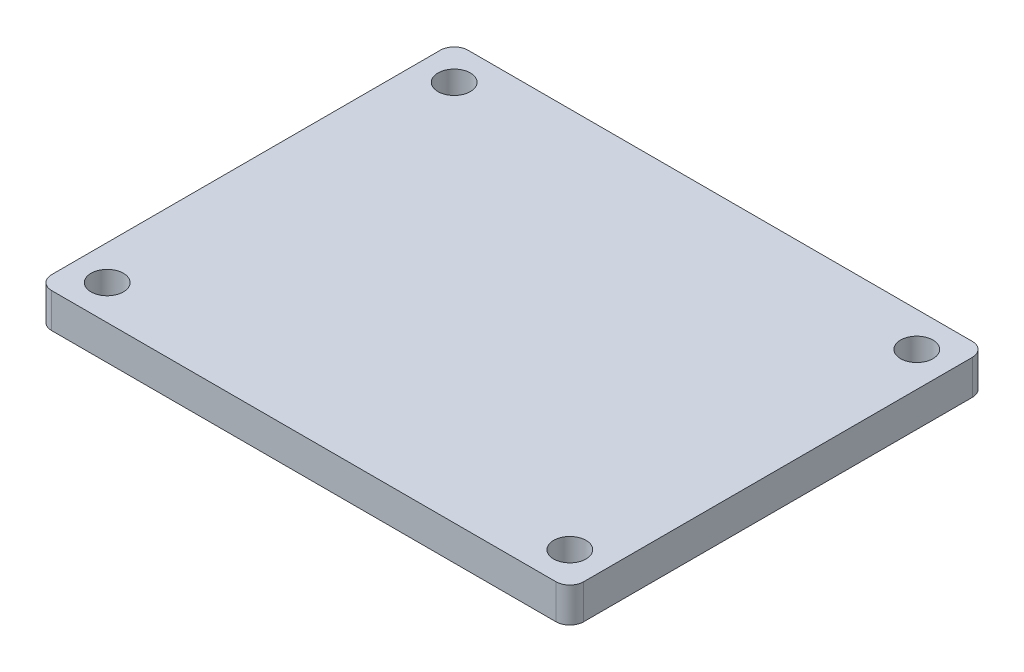
ISO-10303-21;
HEADER;
FILE_DESCRIPTION(('STEP AP214'),'2;1');
FILE_NAME('part.step','',(''),(''),'','','');
FILE_SCHEMA(('AUTOMOTIVE_DESIGN { 1 0 10303 214 1 1 1 1 }'));
ENDSEC;
DATA;
#1=APPLICATION_CONTEXT('core data for automotive mechanical design processes');
#2=APPLICATION_PROTOCOL_DEFINITION('international standard','automotive_design',2000,#1);
#3=PRODUCT_CONTEXT('',#1,'mechanical');
#4=PRODUCT('Part','Part','',(#3));
#5=PRODUCT_RELATED_PRODUCT_CATEGORY('part','',(#4));
#6=PRODUCT_DEFINITION_FORMATION('','',#4);
#7=PRODUCT_DEFINITION_CONTEXT('part definition',#1,'design');
#8=PRODUCT_DEFINITION('design','',#6,#7);
#9=PRODUCT_DEFINITION_SHAPE('','',#8);
#10=(LENGTH_UNIT() NAMED_UNIT(*) SI_UNIT(.MILLI.,.METRE.));
#11=(NAMED_UNIT(*) PLANE_ANGLE_UNIT() SI_UNIT($,.RADIAN.));
#12=(NAMED_UNIT(*) SI_UNIT($,.STERADIAN.) SOLID_ANGLE_UNIT());
#13=UNCERTAINTY_MEASURE_WITH_UNIT(LENGTH_MEASURE(1.E-05),#10,'distance_accuracy_value','');
#14=(GEOMETRIC_REPRESENTATION_CONTEXT(3) GLOBAL_UNCERTAINTY_ASSIGNED_CONTEXT((#13)) GLOBAL_UNIT_ASSIGNED_CONTEXT((#10,
#11,#12)) REPRESENTATION_CONTEXT('',''));
#15=CARTESIAN_POINT('',(0.,0.,0.));
#16=DIRECTION('',(0.,0.,1.));
#17=DIRECTION('',(1.,0.,0.));
#18=AXIS2_PLACEMENT_3D('',#15,#16,#17);
#19=CARTESIAN_POINT('',(54.5,7.5,-42.));
#20=DIRECTION('',(0.,-1.,0.));
#21=DIRECTION('',(0.,0.,-1.));
#22=AXIS2_PLACEMENT_3D('',#19,#20,#21);
#23=CYLINDRICAL_SURFACE('',#22,3.);
#24=CARTESIAN_POINT('',(54.5,0.,-42.));
#25=DIRECTION('',(0.,1.,0.));
#26=DIRECTION('',(0.,0.,1.));
#27=AXIS2_PLACEMENT_3D('',#24,#25,#26);
#28=CIRCLE('',#27,3.);
#29=CARTESIAN_POINT('',(57.5,0.,-42.));
#30=VERTEX_POINT('',#29);
#31=CARTESIAN_POINT('',(54.5,0.,-45.));
#32=VERTEX_POINT('',#31);
#33=EDGE_CURVE('E135',#30,#32,#28,.T.);
#34=ORIENTED_EDGE('',*,*,#33,.T.);
#35=DIRECTION('',(0.,-1.,0.));
#36=VECTOR('',#35,1.);
#37=CARTESIAN_POINT('',(54.5,7.5,-45.));
#38=LINE('',#37,#36);
#39=CARTESIAN_POINT('',(54.5,7.5,-45.));
#40=VERTEX_POINT('',#39);
#41=EDGE_CURVE('E11',#40,#32,#38,.T.);
#42=ORIENTED_EDGE('',*,*,#41,.F.);
#43=CARTESIAN_POINT('',(54.5,7.5,-42.));
#44=DIRECTION('',(0.,1.,0.));
#45=DIRECTION('',(0.,0.,1.));
#46=AXIS2_PLACEMENT_3D('',#43,#44,#45);
#47=CIRCLE('',#46,3.);
#48=CARTESIAN_POINT('',(57.5,7.5,-42.));
#49=VERTEX_POINT('',#48);
#50=EDGE_CURVE('E150',#49,#40,#47,.T.);
#51=ORIENTED_EDGE('',*,*,#50,.F.);
#52=DIRECTION('',(0.,-1.,0.));
#53=VECTOR('',#52,1.);
#54=CARTESIAN_POINT('',(57.5,7.5,-42.));
#55=LINE('',#54,#53);
#56=EDGE_CURVE('E131',#49,#30,#55,.T.);
#57=ORIENTED_EDGE('',*,*,#56,.T.);
#58=EDGE_LOOP('',(#34,#42,#51,#57));
#59=FACE_BOUND('',#58,.T.);
#60=ADVANCED_FACE('F39',(#59),#23,.T.);
#61=CARTESIAN_POINT('',(54.5,7.5,-45.));
#62=DIRECTION('',(0.,0.,1.));
#63=DIRECTION('',(1.,0.,0.));
#64=AXIS2_PLACEMENT_3D('',#61,#62,#63);
#65=PLANE('',#64);
#66=DIRECTION('',(-1.,0.,0.));
#67=VECTOR('',#66,1.);
#68=CARTESIAN_POINT('',(54.5,0.,-45.));
#69=LINE('',#68,#67);
#70=CARTESIAN_POINT('',(-54.5,0.,-45.));
#71=VERTEX_POINT('',#70);
#72=EDGE_CURVE('E138',#32,#71,#69,.T.);
#73=ORIENTED_EDGE('',*,*,#72,.T.);
#74=DIRECTION('',(0.,-1.,0.));
#75=VECTOR('',#74,1.);
#76=CARTESIAN_POINT('',(-54.5,7.5,-45.));
#77=LINE('',#76,#75);
#78=CARTESIAN_POINT('',(-54.5,7.5,-45.));
#79=VERTEX_POINT('',#78);
#80=EDGE_CURVE('E47',#79,#71,#77,.T.);
#81=ORIENTED_EDGE('',*,*,#80,.F.);
#82=DIRECTION('',(-1.,0.,0.));
#83=VECTOR('',#82,1.);
#84=CARTESIAN_POINT('',(54.5,7.5,-45.));
#85=LINE('',#84,#83);
#86=EDGE_CURVE('E98',#40,#79,#85,.T.);
#87=ORIENTED_EDGE('',*,*,#86,.F.);
#88=ORIENTED_EDGE('',*,*,#41,.T.);
#89=EDGE_LOOP('',(#73,#81,#87,#88));
#90=FACE_BOUND('',#89,.T.);
#91=ADVANCED_FACE('F235',(#90),#65,.F.);
#92=CARTESIAN_POINT('',(-54.5,7.5,-42.));
#93=DIRECTION('',(0.,-1.,0.));
#94=DIRECTION('',(0.,0.,-1.));
#95=AXIS2_PLACEMENT_3D('',#92,#93,#94);
#96=CYLINDRICAL_SURFACE('',#95,3.);
#97=CARTESIAN_POINT('',(-54.5,0.,-42.));
#98=DIRECTION('',(0.,1.,0.));
#99=DIRECTION('',(0.,0.,1.));
#100=AXIS2_PLACEMENT_3D('',#97,#98,#99);
#101=CIRCLE('',#100,3.);
#102=CARTESIAN_POINT('',(-57.5,0.,-42.));
#103=VERTEX_POINT('',#102);
#104=EDGE_CURVE('E141',#71,#103,#101,.T.);
#105=ORIENTED_EDGE('',*,*,#104,.T.);
#106=DIRECTION('',(0.,-1.,0.));
#107=VECTOR('',#106,1.);
#108=CARTESIAN_POINT('',(-57.5,7.5,-42.));
#109=LINE('',#108,#107);
#110=CARTESIAN_POINT('',(-57.5,7.5,-42.));
#111=VERTEX_POINT('',#110);
#112=EDGE_CURVE('E157',#111,#103,#109,.T.);
#113=ORIENTED_EDGE('',*,*,#112,.F.);
#114=CARTESIAN_POINT('',(-54.5,7.5,-42.));
#115=DIRECTION('',(0.,1.,0.));
#116=DIRECTION('',(0.,0.,1.));
#117=AXIS2_PLACEMENT_3D('',#114,#115,#116);
#118=CIRCLE('',#117,3.);
#119=EDGE_CURVE('E165',#79,#111,#118,.T.);
#120=ORIENTED_EDGE('',*,*,#119,.F.);
#121=ORIENTED_EDGE('',*,*,#80,.T.);
#122=EDGE_LOOP('',(#105,#113,#120,#121));
#123=FACE_BOUND('',#122,.T.);
#124=ADVANCED_FACE('F163',(#123),#96,.T.);
#125=CARTESIAN_POINT('',(-57.5,7.5,42.));
#126=DIRECTION('',(1.,0.,0.));
#127=DIRECTION('',(0.,0.,-1.));
#128=AXIS2_PLACEMENT_3D('',#125,#126,#127);
#129=PLANE('',#128);
#130=DIRECTION('',(0.,0.,1.));
#131=VECTOR('',#130,1.);
#132=CARTESIAN_POINT('',(-57.5,0.,42.));
#133=LINE('',#132,#131);
#134=CARTESIAN_POINT('',(-57.5,0.,42.));
#135=VERTEX_POINT('',#134);
#136=EDGE_CURVE('E143',#103,#135,#133,.T.);
#137=ORIENTED_EDGE('',*,*,#136,.T.);
#138=DIRECTION('',(0.,-1.,0.));
#139=VECTOR('',#138,1.);
#140=CARTESIAN_POINT('',(-57.5,7.5,42.));
#141=LINE('',#140,#139);
#142=CARTESIAN_POINT('',(-57.5,7.5,42.));
#143=VERTEX_POINT('',#142);
#144=EDGE_CURVE('E154',#143,#135,#141,.T.);
#145=ORIENTED_EDGE('',*,*,#144,.F.);
#146=DIRECTION('',(0.,0.,1.));
#147=VECTOR('',#146,1.);
#148=CARTESIAN_POINT('',(-57.5,7.5,42.));
#149=LINE('',#148,#147);
#150=EDGE_CURVE('E177',#111,#143,#149,.T.);
#151=ORIENTED_EDGE('',*,*,#150,.F.);
#152=ORIENTED_EDGE('',*,*,#112,.T.);
#153=EDGE_LOOP('',(#137,#145,#151,#152));
#154=FACE_BOUND('',#153,.T.);
#155=ADVANCED_FACE('F173',(#154),#129,.F.);
#156=CARTESIAN_POINT('',(-54.5,7.5,42.));
#157=DIRECTION('',(0.,-1.,0.));
#158=DIRECTION('',(0.,0.,-1.));
#159=AXIS2_PLACEMENT_3D('',#156,#157,#158);
#160=CYLINDRICAL_SURFACE('',#159,3.);
#161=CARTESIAN_POINT('',(-54.5,0.,42.));
#162=DIRECTION('',(0.,1.,0.));
#163=DIRECTION('',(0.,0.,-1.));
#164=AXIS2_PLACEMENT_3D('',#161,#162,#163);
#165=CIRCLE('',#164,3.);
#166=CARTESIAN_POINT('',(-54.5,0.,45.));
#167=VERTEX_POINT('',#166);
#168=EDGE_CURVE('E145',#135,#167,#165,.T.);
#169=ORIENTED_EDGE('',*,*,#168,.T.);
#170=DIRECTION('',(0.,-1.,0.));
#171=VECTOR('',#170,1.);
#172=CARTESIAN_POINT('',(-54.5,7.5,45.));
#173=LINE('',#172,#171);
#174=CARTESIAN_POINT('',(-54.5,7.5,45.));
#175=VERTEX_POINT('',#174);
#176=EDGE_CURVE('E126',#175,#167,#173,.T.);
#177=ORIENTED_EDGE('',*,*,#176,.F.);
#178=CARTESIAN_POINT('',(-54.5,7.5,42.));
#179=DIRECTION('',(0.,1.,0.));
#180=DIRECTION('',(0.,0.,-1.));
#181=AXIS2_PLACEMENT_3D('',#178,#179,#180);
#182=CIRCLE('',#181,3.);
#183=EDGE_CURVE('E117',#143,#175,#182,.T.);
#184=ORIENTED_EDGE('',*,*,#183,.F.);
#185=ORIENTED_EDGE('',*,*,#144,.T.);
#186=EDGE_LOOP('',(#169,#177,#184,#185));
#187=FACE_BOUND('',#186,.T.);
#188=ADVANCED_FACE('F176',(#187),#160,.T.);
#189=CARTESIAN_POINT('',(54.5,7.5,45.));
#190=DIRECTION('',(0.,0.,-1.));
#191=DIRECTION('',(-1.,0.,0.));
#192=AXIS2_PLACEMENT_3D('',#189,#190,#191);
#193=PLANE('',#192);
#194=DIRECTION('',(1.,0.,0.));
#195=VECTOR('',#194,1.);
#196=CARTESIAN_POINT('',(54.5,0.,45.));
#197=LINE('',#196,#195);
#198=CARTESIAN_POINT('',(54.5,0.,45.));
#199=VERTEX_POINT('',#198);
#200=EDGE_CURVE('E125',#167,#199,#197,.T.);
#201=ORIENTED_EDGE('',*,*,#200,.T.);
#202=DIRECTION('',(0.,-1.,0.));
#203=VECTOR('',#202,1.);
#204=CARTESIAN_POINT('',(54.5,7.5,45.));
#205=LINE('',#204,#203);
#206=CARTESIAN_POINT('',(54.5,7.5,45.));
#207=VERTEX_POINT('',#206);
#208=EDGE_CURVE('E122',#207,#199,#205,.T.);
#209=ORIENTED_EDGE('',*,*,#208,.F.);
#210=DIRECTION('',(1.,0.,0.));
#211=VECTOR('',#210,1.);
#212=CARTESIAN_POINT('',(54.5,7.5,45.));
#213=LINE('',#212,#211);
#214=EDGE_CURVE('E111',#175,#207,#213,.T.);
#215=ORIENTED_EDGE('',*,*,#214,.F.);
#216=ORIENTED_EDGE('',*,*,#176,.T.);
#217=EDGE_LOOP('',(#201,#209,#215,#216));
#218=FACE_BOUND('',#217,.T.);
#219=ADVANCED_FACE('F123',(#218),#193,.F.);
#220=CARTESIAN_POINT('',(54.5,7.5,42.));
#221=DIRECTION('',(0.,-1.,0.));
#222=DIRECTION('',(0.,0.,-1.));
#223=AXIS2_PLACEMENT_3D('',#220,#221,#222);
#224=CYLINDRICAL_SURFACE('',#223,3.);
#225=CARTESIAN_POINT('',(54.5,0.,42.));
#226=DIRECTION('',(0.,1.,0.));
#227=DIRECTION('',(0.,0.,1.));
#228=AXIS2_PLACEMENT_3D('',#225,#226,#227);
#229=CIRCLE('',#228,3.);
#230=CARTESIAN_POINT('',(57.5,0.,42.));
#231=VERTEX_POINT('',#230);
#232=EDGE_CURVE('E84',#199,#231,#229,.T.);
#233=ORIENTED_EDGE('',*,*,#232,.T.);
#234=DIRECTION('',(0.,-1.,0.));
#235=VECTOR('',#234,1.);
#236=CARTESIAN_POINT('',(57.5,7.5,42.));
#237=LINE('',#236,#235);
#238=CARTESIAN_POINT('',(57.5,7.5,42.));
#239=VERTEX_POINT('',#238);
#240=EDGE_CURVE('E127',#239,#231,#237,.T.);
#241=ORIENTED_EDGE('',*,*,#240,.F.);
#242=CARTESIAN_POINT('',(54.5,7.5,42.));
#243=DIRECTION('',(0.,1.,0.));
#244=DIRECTION('',(0.,0.,1.));
#245=AXIS2_PLACEMENT_3D('',#242,#243,#244);
#246=CIRCLE('',#245,3.);
#247=EDGE_CURVE('E115',#207,#239,#246,.T.);
#248=ORIENTED_EDGE('',*,*,#247,.F.);
#249=ORIENTED_EDGE('',*,*,#208,.T.);
#250=EDGE_LOOP('',(#233,#241,#248,#249));
#251=FACE_BOUND('',#250,.T.);
#252=ADVANCED_FACE('F129',(#251),#224,.T.);
#253=CARTESIAN_POINT('',(57.5,7.5,42.));
#254=DIRECTION('',(-1.,0.,0.));
#255=DIRECTION('',(0.,0.,1.));
#256=AXIS2_PLACEMENT_3D('',#253,#254,#255);
#257=PLANE('',#256);
#258=DIRECTION('',(0.,0.,-1.));
#259=VECTOR('',#258,1.);
#260=CARTESIAN_POINT('',(57.5,0.,42.));
#261=LINE('',#260,#259);
#262=EDGE_CURVE('E90',#231,#30,#261,.T.);
#263=ORIENTED_EDGE('',*,*,#262,.T.);
#264=ORIENTED_EDGE('',*,*,#56,.F.);
#265=DIRECTION('',(0.,0.,-1.));
#266=VECTOR('',#265,1.);
#267=CARTESIAN_POINT('',(57.5,7.5,42.));
#268=LINE('',#267,#266);
#269=EDGE_CURVE('E55',#239,#49,#268,.T.);
#270=ORIENTED_EDGE('',*,*,#269,.F.);
#271=ORIENTED_EDGE('',*,*,#240,.T.);
#272=EDGE_LOOP('',(#263,#264,#270,#271));
#273=FACE_BOUND('',#272,.T.);
#274=ADVANCED_FACE('F211',(#273),#257,.F.);
#275=CARTESIAN_POINT('',(54.5,7.5,-42.));
#276=DIRECTION('',(0.,1.,0.));
#277=DIRECTION('',(0.,0.,1.));
#278=AXIS2_PLACEMENT_3D('',#275,#276,#277);
#279=PLANE('',#278);
#280=CARTESIAN_POINT('',(-50.,7.5,-37.5));
#281=DIRECTION('',(0.,1.,0.));
#282=DIRECTION('',(0.,0.,1.));
#283=AXIS2_PLACEMENT_3D('',#280,#281,#282);
#284=CIRCLE('',#283,3.5);
#285=CARTESIAN_POINT('',(-50.,7.5,-34.));
#286=VERTEX_POINT('',#285);
#287=EDGE_CURVE('E203',#286,#286,#284,.T.);
#288=ORIENTED_EDGE('',*,*,#287,.F.);
#289=EDGE_LOOP('',(#288));
#290=FACE_BOUND('',#289,.T.);
#291=CARTESIAN_POINT('',(50.,7.5,-37.5));
#292=DIRECTION('',(0.,1.,0.));
#293=DIRECTION('',(0.,0.,1.));
#294=AXIS2_PLACEMENT_3D('',#291,#292,#293);
#295=CIRCLE('',#294,3.5);
#296=CARTESIAN_POINT('',(50.,7.5,-34.));
#297=VERTEX_POINT('',#296);
#298=EDGE_CURVE('E197',#297,#297,#295,.T.);
#299=ORIENTED_EDGE('',*,*,#298,.F.);
#300=EDGE_LOOP('',(#299));
#301=FACE_BOUND('',#300,.T.);
#302=CARTESIAN_POINT('',(50.,7.5,37.5));
#303=DIRECTION('',(0.,1.,0.));
#304=DIRECTION('',(0.,0.,1.));
#305=AXIS2_PLACEMENT_3D('',#302,#303,#304);
#306=CIRCLE('',#305,3.5);
#307=CARTESIAN_POINT('',(50.,7.5,41.));
#308=VERTEX_POINT('',#307);
#309=EDGE_CURVE('E191',#308,#308,#306,.T.);
#310=ORIENTED_EDGE('',*,*,#309,.F.);
#311=EDGE_LOOP('',(#310));
#312=FACE_BOUND('',#311,.T.);
#313=CARTESIAN_POINT('',(-50.,7.5,37.5));
#314=DIRECTION('',(0.,1.,0.));
#315=DIRECTION('',(0.,0.,1.));
#316=AXIS2_PLACEMENT_3D('',#313,#314,#315);
#317=CIRCLE('',#316,3.5);
#318=CARTESIAN_POINT('',(-50.,7.5,41.));
#319=VERTEX_POINT('',#318);
#320=EDGE_CURVE('E185',#319,#319,#317,.T.);
#321=ORIENTED_EDGE('',*,*,#320,.F.);
#322=EDGE_LOOP('',(#321));
#323=FACE_BOUND('',#322,.T.);
#324=ORIENTED_EDGE('',*,*,#50,.T.);
#325=ORIENTED_EDGE('',*,*,#86,.T.);
#326=ORIENTED_EDGE('',*,*,#119,.T.);
#327=ORIENTED_EDGE('',*,*,#150,.T.);
#328=ORIENTED_EDGE('',*,*,#183,.T.);
#329=ORIENTED_EDGE('',*,*,#214,.T.);
#330=ORIENTED_EDGE('',*,*,#247,.T.);
#331=ORIENTED_EDGE('',*,*,#269,.T.);
#332=EDGE_LOOP('',(#324,#325,#326,#327,#328,#329,#330,#331));
#333=FACE_BOUND('',#332,.T.);
#334=ADVANCED_FACE('F113',(#290,#301,#312,#323,#333),#279,.T.);
#335=CARTESIAN_POINT('',(54.5,0.,-42.));
#336=DIRECTION('',(0.,1.,0.));
#337=DIRECTION('',(0.,0.,1.));
#338=AXIS2_PLACEMENT_3D('',#335,#336,#337);
#339=PLANE('',#338);
#340=CARTESIAN_POINT('',(-50.,0.,-37.5));
#341=DIRECTION('',(0.,1.,0.));
#342=DIRECTION('',(0.,0.,1.));
#343=AXIS2_PLACEMENT_3D('',#340,#341,#342);
#344=CIRCLE('',#343,3.5);
#345=CARTESIAN_POINT('',(-50.,0.,-34.));
#346=VERTEX_POINT('',#345);
#347=EDGE_CURVE('E200',#346,#346,#344,.T.);
#348=ORIENTED_EDGE('',*,*,#347,.T.);
#349=EDGE_LOOP('',(#348));
#350=FACE_BOUND('',#349,.T.);
#351=CARTESIAN_POINT('',(50.,0.,-37.5));
#352=DIRECTION('',(0.,1.,0.));
#353=DIRECTION('',(0.,0.,1.));
#354=AXIS2_PLACEMENT_3D('',#351,#352,#353);
#355=CIRCLE('',#354,3.5);
#356=CARTESIAN_POINT('',(50.,0.,-34.));
#357=VERTEX_POINT('',#356);
#358=EDGE_CURVE('E194',#357,#357,#355,.T.);
#359=ORIENTED_EDGE('',*,*,#358,.T.);
#360=EDGE_LOOP('',(#359));
#361=FACE_BOUND('',#360,.T.);
#362=CARTESIAN_POINT('',(50.,0.,37.5));
#363=DIRECTION('',(0.,1.,0.));
#364=DIRECTION('',(0.,0.,1.));
#365=AXIS2_PLACEMENT_3D('',#362,#363,#364);
#366=CIRCLE('',#365,3.5);
#367=CARTESIAN_POINT('',(50.,0.,41.));
#368=VERTEX_POINT('',#367);
#369=EDGE_CURVE('E188',#368,#368,#366,.T.);
#370=ORIENTED_EDGE('',*,*,#369,.T.);
#371=EDGE_LOOP('',(#370));
#372=FACE_BOUND('',#371,.T.);
#373=CARTESIAN_POINT('',(-50.,0.,37.5));
#374=DIRECTION('',(0.,1.,0.));
#375=DIRECTION('',(0.,0.,1.));
#376=AXIS2_PLACEMENT_3D('',#373,#374,#375);
#377=CIRCLE('',#376,3.5);
#378=CARTESIAN_POINT('',(-50.,0.,41.));
#379=VERTEX_POINT('',#378);
#380=EDGE_CURVE('E139',#379,#379,#377,.T.);
#381=ORIENTED_EDGE('',*,*,#380,.T.);
#382=EDGE_LOOP('',(#381));
#383=FACE_BOUND('',#382,.T.);
#384=ORIENTED_EDGE('',*,*,#33,.F.);
#385=ORIENTED_EDGE('',*,*,#262,.F.);
#386=ORIENTED_EDGE('',*,*,#232,.F.);
#387=ORIENTED_EDGE('',*,*,#200,.F.);
#388=ORIENTED_EDGE('',*,*,#168,.F.);
#389=ORIENTED_EDGE('',*,*,#136,.F.);
#390=ORIENTED_EDGE('',*,*,#104,.F.);
#391=ORIENTED_EDGE('',*,*,#72,.F.);
#392=EDGE_LOOP('',(#384,#385,#386,#387,#388,#389,#390,#391));
#393=FACE_BOUND('',#392,.T.);
#394=ADVANCED_FACE('F169',(#350,#361,#372,#383,#393),#339,.F.);
#395=CARTESIAN_POINT('',(-50.,7.5,37.5));
#396=DIRECTION('',(0.,1.,0.));
#397=DIRECTION('',(0.,0.,1.));
#398=AXIS2_PLACEMENT_3D('',#395,#396,#397);
#399=CYLINDRICAL_SURFACE('',#398,3.5);
#400=ORIENTED_EDGE('',*,*,#380,.F.);
#401=EDGE_LOOP('',(#400));
#402=FACE_BOUND('',#401,.T.);
#403=ORIENTED_EDGE('',*,*,#320,.T.);
#404=EDGE_LOOP('',(#403));
#405=FACE_BOUND('',#404,.T.);
#406=ADVANCED_FACE('F219',(#402,#405),#399,.F.);
#407=CARTESIAN_POINT('',(50.,7.5,37.5));
#408=DIRECTION('',(0.,1.,0.));
#409=DIRECTION('',(0.,0.,1.));
#410=AXIS2_PLACEMENT_3D('',#407,#408,#409);
#411=CYLINDRICAL_SURFACE('',#410,3.5);
#412=ORIENTED_EDGE('',*,*,#369,.F.);
#413=EDGE_LOOP('',(#412));
#414=FACE_BOUND('',#413,.T.);
#415=ORIENTED_EDGE('',*,*,#309,.T.);
#416=EDGE_LOOP('',(#415));
#417=FACE_BOUND('',#416,.T.);
#418=ADVANCED_FACE('F221',(#414,#417),#411,.F.);
#419=CARTESIAN_POINT('',(50.,7.5,-37.5));
#420=DIRECTION('',(0.,1.,0.));
#421=DIRECTION('',(0.,0.,1.));
#422=AXIS2_PLACEMENT_3D('',#419,#420,#421);
#423=CYLINDRICAL_SURFACE('',#422,3.5);
#424=ORIENTED_EDGE('',*,*,#358,.F.);
#425=EDGE_LOOP('',(#424));
#426=FACE_BOUND('',#425,.T.);
#427=ORIENTED_EDGE('',*,*,#298,.T.);
#428=EDGE_LOOP('',(#427));
#429=FACE_BOUND('',#428,.T.);
#430=ADVANCED_FACE('F228',(#426,#429),#423,.F.);
#431=CARTESIAN_POINT('',(-50.,7.5,-37.5));
#432=DIRECTION('',(0.,1.,0.));
#433=DIRECTION('',(0.,0.,1.));
#434=AXIS2_PLACEMENT_3D('',#431,#432,#433);
#435=CYLINDRICAL_SURFACE('',#434,3.5);
#436=ORIENTED_EDGE('',*,*,#347,.F.);
#437=EDGE_LOOP('',(#436));
#438=FACE_BOUND('',#437,.T.);
#439=ORIENTED_EDGE('',*,*,#287,.T.);
#440=EDGE_LOOP('',(#439));
#441=FACE_BOUND('',#440,.T.);
#442=ADVANCED_FACE('F207',(#438,#441),#435,.F.);
#443=CLOSED_SHELL('',(#60,#91,#124,#155,#188,#219,#252,#274,#334,#394,#406,#418,#430,#442));
#444=MANIFOLD_SOLID_BREP('B2',#443);
#445=ADVANCED_BREP_SHAPE_REPRESENTATION('',(#18,#444),#14);
#446=SHAPE_DEFINITION_REPRESENTATION(#9,#445);
ENDSEC;
END-ISO-10303-21;
